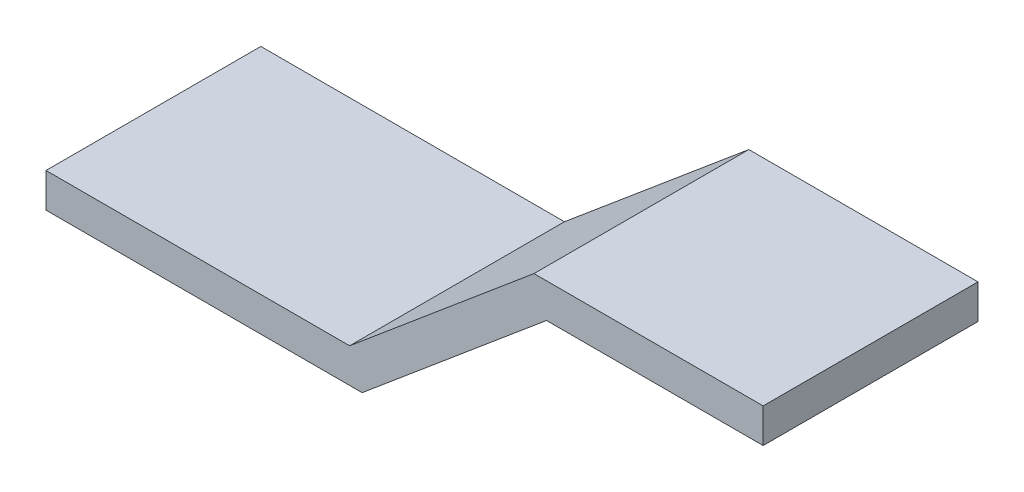
ISO-10303-21;
HEADER;
FILE_DESCRIPTION(('STEP AP214'),'2;1');
FILE_NAME('part.step','',(''),(''),'','','');
FILE_SCHEMA(('AUTOMOTIVE_DESIGN { 1 0 10303 214 1 1 1 1 }'));
ENDSEC;
DATA;
#1=APPLICATION_CONTEXT('core data for automotive mechanical design processes');
#2=APPLICATION_PROTOCOL_DEFINITION('international standard','automotive_design',2000,#1);
#3=PRODUCT_CONTEXT('',#1,'mechanical');
#4=PRODUCT('Part','Part','',(#3));
#5=PRODUCT_RELATED_PRODUCT_CATEGORY('part','',(#4));
#6=PRODUCT_DEFINITION_FORMATION('','',#4);
#7=PRODUCT_DEFINITION_CONTEXT('part definition',#1,'design');
#8=PRODUCT_DEFINITION('design','',#6,#7);
#9=PRODUCT_DEFINITION_SHAPE('','',#8);
#10=(LENGTH_UNIT() NAMED_UNIT(*) SI_UNIT(.MILLI.,.METRE.));
#11=(NAMED_UNIT(*) PLANE_ANGLE_UNIT() SI_UNIT($,.RADIAN.));
#12=(NAMED_UNIT(*) SI_UNIT($,.STERADIAN.) SOLID_ANGLE_UNIT());
#13=UNCERTAINTY_MEASURE_WITH_UNIT(LENGTH_MEASURE(1.E-05),#10,'distance_accuracy_value','');
#14=(GEOMETRIC_REPRESENTATION_CONTEXT(3) GLOBAL_UNCERTAINTY_ASSIGNED_CONTEXT((#13)) GLOBAL_UNIT_ASSIGNED_CONTEXT((#10,
#11,#12)) REPRESENTATION_CONTEXT('',''));
#15=CARTESIAN_POINT('',(0.,0.,0.));
#16=DIRECTION('',(0.,0.,1.));
#17=DIRECTION('',(1.,0.,0.));
#18=AXIS2_PLACEMENT_3D('',#15,#16,#17);
#19=CARTESIAN_POINT('',(186.55301294401,54.,37.5));
#20=DIRECTION('',(-1.,0.,0.));
#21=DIRECTION('',(0.,0.,1.));
#22=AXIS2_PLACEMENT_3D('',#19,#20,#21);
#23=PLANE('',#22);
#24=DIRECTION('',(0.,1.,0.));
#25=VECTOR('',#24,1.);
#26=CARTESIAN_POINT('',(186.55301294401,54.,-37.5));
#27=LINE('',#26,#25);
#28=CARTESIAN_POINT('',(186.55301294401,42.,-37.5));
#29=VERTEX_POINT('',#28);
#30=CARTESIAN_POINT('',(186.55301294401,54.,-37.5));
#31=VERTEX_POINT('',#30);
#32=EDGE_CURVE('E133',#29,#31,#27,.T.);
#33=ORIENTED_EDGE('',*,*,#32,.T.);
#34=DIRECTION('',(0.,0.,-1.));
#35=VECTOR('',#34,1.);
#36=CARTESIAN_POINT('',(186.55301294401,54.,37.5));
#37=LINE('',#36,#35);
#38=CARTESIAN_POINT('',(186.55301294401,54.,37.5));
#39=VERTEX_POINT('',#38);
#40=EDGE_CURVE('E11',#39,#31,#37,.T.);
#41=ORIENTED_EDGE('',*,*,#40,.F.);
#42=DIRECTION('',(0.,1.,0.));
#43=VECTOR('',#42,1.);
#44=CARTESIAN_POINT('',(186.55301294401,54.,37.5));
#45=LINE('',#44,#43);
#46=CARTESIAN_POINT('',(186.55301294401,42.,37.5));
#47=VERTEX_POINT('',#46);
#48=EDGE_CURVE('E147',#47,#39,#45,.T.);
#49=ORIENTED_EDGE('',*,*,#48,.F.);
#50=DIRECTION('',(0.,0.,-1.));
#51=VECTOR('',#50,1.);
#52=CARTESIAN_POINT('',(186.55301294401,42.,37.5));
#53=LINE('',#52,#51);
#54=EDGE_CURVE('E129',#47,#29,#53,.T.);
#55=ORIENTED_EDGE('',*,*,#54,.T.);
#56=EDGE_LOOP('',(#33,#41,#49,#55));
#57=FACE_BOUND('',#56,.T.);
#58=ADVANCED_FACE('F37',(#57),#23,.F.);
#59=CARTESIAN_POINT('',(186.55301294401,54.,37.5));
#60=DIRECTION('',(0.,-1.,0.));
#61=DIRECTION('',(1.,0.,0.));
#62=AXIS2_PLACEMENT_3D('',#59,#60,#61);
#63=PLANE('',#62);
#64=DIRECTION('',(-1.,0.,0.));
#65=VECTOR('',#64,1.);
#66=CARTESIAN_POINT('',(186.55301294401,54.,-37.5));
#67=LINE('',#66,#65);
#68=CARTESIAN_POINT('',(106.55301294401,54.,-37.5));
#69=VERTEX_POINT('',#68);
#70=EDGE_CURVE('E136',#31,#69,#67,.T.);
#71=ORIENTED_EDGE('',*,*,#70,.T.);
#72=DIRECTION('',(0.,0.,-1.));
#73=VECTOR('',#72,1.);
#74=CARTESIAN_POINT('',(106.55301294401,54.,37.5));
#75=LINE('',#74,#73);
#76=CARTESIAN_POINT('',(106.55301294401,54.,37.5));
#77=VERTEX_POINT('',#76);
#78=EDGE_CURVE('E45',#77,#69,#75,.T.);
#79=ORIENTED_EDGE('',*,*,#78,.F.);
#80=DIRECTION('',(-1.,0.,0.));
#81=VECTOR('',#80,1.);
#82=CARTESIAN_POINT('',(186.55301294401,54.,37.5));
#83=LINE('',#82,#81);
#84=EDGE_CURVE('E96',#39,#77,#83,.T.);
#85=ORIENTED_EDGE('',*,*,#84,.F.);
#86=ORIENTED_EDGE('',*,*,#40,.T.);
#87=EDGE_LOOP('',(#71,#79,#85,#86));
#88=FACE_BOUND('',#87,.T.);
#89=ADVANCED_FACE('F182',(#88),#63,.F.);
#90=CARTESIAN_POINT('',(106.55301294401,54.,37.5));
#91=DIRECTION('',(0.642787609686535,-0.766044443118982,0.));
#92=DIRECTION('',(0.766044443118982,0.642787609686535,0.));
#93=AXIS2_PLACEMENT_3D('',#90,#91,#92);
#94=PLANE('',#93);
#95=DIRECTION('',(-0.766044443118982,-0.642787609686535,0.));
#96=VECTOR('',#95,1.);
#97=CARTESIAN_POINT('',(106.55301294401,54.,-37.5));
#98=LINE('',#97,#96);
#99=CARTESIAN_POINT('',(42.1983189439217,0.,-37.5));
#100=VERTEX_POINT('',#99);
#101=EDGE_CURVE('E138',#69,#100,#98,.T.);
#102=ORIENTED_EDGE('',*,*,#101,.T.);
#103=DIRECTION('',(0.,0.,-1.));
#104=VECTOR('',#103,1.);
#105=CARTESIAN_POINT('',(42.1983189439217,0.,37.5));
#106=LINE('',#105,#104);
#107=CARTESIAN_POINT('',(42.1983189439217,0.,37.5));
#108=VERTEX_POINT('',#107);
#109=EDGE_CURVE('E154',#108,#100,#106,.T.);
#110=ORIENTED_EDGE('',*,*,#109,.F.);
#111=DIRECTION('',(-0.766044443118982,-0.642787609686535,0.));
#112=VECTOR('',#111,1.);
#113=CARTESIAN_POINT('',(106.55301294401,54.,37.5));
#114=LINE('',#113,#112);
#115=EDGE_CURVE('E162',#77,#108,#114,.T.);
#116=ORIENTED_EDGE('',*,*,#115,.F.);
#117=ORIENTED_EDGE('',*,*,#78,.T.);
#118=EDGE_LOOP('',(#102,#110,#116,#117));
#119=FACE_BOUND('',#118,.T.);
#120=ADVANCED_FACE('F160',(#119),#94,.F.);
#121=CARTESIAN_POINT('',(42.1983189439217,0.,37.5));
#122=DIRECTION('',(0.,-1.,0.));
#123=DIRECTION('',(1.,0.,0.));
#124=AXIS2_PLACEMENT_3D('',#121,#122,#123);
#125=PLANE('',#124);
#126=DIRECTION('',(-1.,0.,0.));
#127=VECTOR('',#126,1.);
#128=CARTESIAN_POINT('',(42.1983189439217,0.,-37.5));
#129=LINE('',#128,#127);
#130=CARTESIAN_POINT('',(-63.8016810560783,0.,-37.5));
#131=VERTEX_POINT('',#130);
#132=EDGE_CURVE('E140',#100,#131,#129,.T.);
#133=ORIENTED_EDGE('',*,*,#132,.T.);
#134=DIRECTION('',(0.,0.,-1.));
#135=VECTOR('',#134,1.);
#136=CARTESIAN_POINT('',(-63.8016810560783,0.,37.5));
#137=LINE('',#136,#135);
#138=CARTESIAN_POINT('',(-63.8016810560783,0.,37.5));
#139=VERTEX_POINT('',#138);
#140=EDGE_CURVE('E151',#139,#131,#137,.T.);
#141=ORIENTED_EDGE('',*,*,#140,.F.);
#142=DIRECTION('',(-1.,0.,0.));
#143=VECTOR('',#142,1.);
#144=CARTESIAN_POINT('',(42.1983189439217,0.,37.5));
#145=LINE('',#144,#143);
#146=EDGE_CURVE('E174',#108,#139,#145,.T.);
#147=ORIENTED_EDGE('',*,*,#146,.F.);
#148=ORIENTED_EDGE('',*,*,#109,.T.);
#149=EDGE_LOOP('',(#133,#141,#147,#148));
#150=FACE_BOUND('',#149,.T.);
#151=ADVANCED_FACE('F170',(#150),#125,.F.);
#152=CARTESIAN_POINT('',(-63.8016810560783,0.,37.5));
#153=DIRECTION('',(1.,0.,0.));
#154=DIRECTION('',(0.,0.,-1.));
#155=AXIS2_PLACEMENT_3D('',#152,#153,#154);
#156=PLANE('',#155);
#157=DIRECTION('',(0.,-1.,0.));
#158=VECTOR('',#157,1.);
#159=CARTESIAN_POINT('',(-63.8016810560783,0.,-37.5));
#160=LINE('',#159,#158);
#161=CARTESIAN_POINT('',(-63.8016810560783,-12.,-37.5));
#162=VERTEX_POINT('',#161);
#163=EDGE_CURVE('E142',#131,#162,#160,.T.);
#164=ORIENTED_EDGE('',*,*,#163,.T.);
#165=DIRECTION('',(0.,0.,-1.));
#166=VECTOR('',#165,1.);
#167=CARTESIAN_POINT('',(-63.8016810560783,-12.,37.5));
#168=LINE('',#167,#166);
#169=CARTESIAN_POINT('',(-63.8016810560783,-12.,37.5));
#170=VERTEX_POINT('',#169);
#171=EDGE_CURVE('E124',#170,#162,#168,.T.);
#172=ORIENTED_EDGE('',*,*,#171,.F.);
#173=DIRECTION('',(0.,-1.,0.));
#174=VECTOR('',#173,1.);
#175=CARTESIAN_POINT('',(-63.8016810560783,0.,37.5));
#176=LINE('',#175,#174);
#177=EDGE_CURVE('E115',#139,#170,#176,.T.);
#178=ORIENTED_EDGE('',*,*,#177,.F.);
#179=ORIENTED_EDGE('',*,*,#140,.T.);
#180=EDGE_LOOP('',(#164,#172,#178,#179));
#181=FACE_BOUND('',#180,.T.);
#182=ADVANCED_FACE('F173',(#181),#156,.F.);
#183=CARTESIAN_POINT('',(46.5659617551161,-12.,37.5));
#184=DIRECTION('',(0.,1.,0.));
#185=DIRECTION('',(0.,0.,1.));
#186=AXIS2_PLACEMENT_3D('',#183,#184,#185);
#187=PLANE('',#186);
#188=DIRECTION('',(1.,0.,0.));
#189=VECTOR('',#188,1.);
#190=CARTESIAN_POINT('',(46.5659617551161,-12.,-37.5));
#191=LINE('',#190,#189);
#192=CARTESIAN_POINT('',(46.5659617551161,-12.,-37.5));
#193=VERTEX_POINT('',#192);
#194=EDGE_CURVE('E123',#162,#193,#191,.T.);
#195=ORIENTED_EDGE('',*,*,#194,.T.);
#196=DIRECTION('',(0.,0.,-1.));
#197=VECTOR('',#196,1.);
#198=CARTESIAN_POINT('',(46.5659617551161,-12.,37.5));
#199=LINE('',#198,#197);
#200=CARTESIAN_POINT('',(46.5659617551161,-12.,37.5));
#201=VERTEX_POINT('',#200);
#202=EDGE_CURVE('E120',#201,#193,#199,.T.);
#203=ORIENTED_EDGE('',*,*,#202,.F.);
#204=DIRECTION('',(1.,0.,0.));
#205=VECTOR('',#204,1.);
#206=CARTESIAN_POINT('',(46.5659617551161,-12.,37.5));
#207=LINE('',#206,#205);
#208=EDGE_CURVE('E109',#170,#201,#207,.T.);
#209=ORIENTED_EDGE('',*,*,#208,.F.);
#210=ORIENTED_EDGE('',*,*,#171,.T.);
#211=EDGE_LOOP('',(#195,#203,#209,#210));
#212=FACE_BOUND('',#211,.T.);
#213=ADVANCED_FACE('F121',(#212),#187,.F.);
#214=CARTESIAN_POINT('',(110.920655755204,42.,37.5));
#215=DIRECTION('',(-0.642787609686535,0.766044443118982,0.));
#216=DIRECTION('',(-0.766044443118982,-0.642787609686535,0.));
#217=AXIS2_PLACEMENT_3D('',#214,#215,#216);
#218=PLANE('',#217);
#219=DIRECTION('',(0.766044443118982,0.642787609686535,0.));
#220=VECTOR('',#219,1.);
#221=CARTESIAN_POINT('',(110.920655755204,42.,-37.5));
#222=LINE('',#221,#220);
#223=CARTESIAN_POINT('',(110.920655755204,42.,-37.5));
#224=VERTEX_POINT('',#223);
#225=EDGE_CURVE('E82',#193,#224,#222,.T.);
#226=ORIENTED_EDGE('',*,*,#225,.T.);
#227=DIRECTION('',(0.,0.,-1.));
#228=VECTOR('',#227,1.);
#229=CARTESIAN_POINT('',(110.920655755204,42.,37.5));
#230=LINE('',#229,#228);
#231=CARTESIAN_POINT('',(110.920655755204,42.,37.5));
#232=VERTEX_POINT('',#231);
#233=EDGE_CURVE('E125',#232,#224,#230,.T.);
#234=ORIENTED_EDGE('',*,*,#233,.F.);
#235=DIRECTION('',(0.766044443118982,0.642787609686535,0.));
#236=VECTOR('',#235,1.);
#237=CARTESIAN_POINT('',(110.920655755204,42.,37.5));
#238=LINE('',#237,#236);
#239=EDGE_CURVE('E113',#201,#232,#238,.T.);
#240=ORIENTED_EDGE('',*,*,#239,.F.);
#241=ORIENTED_EDGE('',*,*,#202,.T.);
#242=EDGE_LOOP('',(#226,#234,#240,#241));
#243=FACE_BOUND('',#242,.T.);
#244=ADVANCED_FACE('F127',(#243),#218,.F.);
#245=CARTESIAN_POINT('',(186.55301294401,42.,37.5));
#246=DIRECTION('',(0.,1.,0.));
#247=DIRECTION('',(0.,0.,1.));
#248=AXIS2_PLACEMENT_3D('',#245,#246,#247);
#249=PLANE('',#248);
#250=DIRECTION('',(1.,0.,0.));
#251=VECTOR('',#250,1.);
#252=CARTESIAN_POINT('',(186.55301294401,42.,-37.5));
#253=LINE('',#252,#251);
#254=EDGE_CURVE('E88',#224,#29,#253,.T.);
#255=ORIENTED_EDGE('',*,*,#254,.T.);
#256=ORIENTED_EDGE('',*,*,#54,.F.);
#257=DIRECTION('',(1.,0.,0.));
#258=VECTOR('',#257,1.);
#259=CARTESIAN_POINT('',(186.55301294401,42.,37.5));
#260=LINE('',#259,#258);
#261=EDGE_CURVE('E53',#232,#47,#260,.T.);
#262=ORIENTED_EDGE('',*,*,#261,.F.);
#263=ORIENTED_EDGE('',*,*,#233,.T.);
#264=EDGE_LOOP('',(#255,#256,#262,#263));
#265=FACE_BOUND('',#264,.T.);
#266=ADVANCED_FACE('F198',(#265),#249,.F.);
#267=CARTESIAN_POINT('',(0.,0.,37.5));
#268=DIRECTION('',(0.,0.,-1.));
#269=DIRECTION('',(-1.,0.,0.));
#270=AXIS2_PLACEMENT_3D('',#267,#268,#269);
#271=PLANE('',#270);
#272=ORIENTED_EDGE('',*,*,#48,.T.);
#273=ORIENTED_EDGE('',*,*,#84,.T.);
#274=ORIENTED_EDGE('',*,*,#115,.T.);
#275=ORIENTED_EDGE('',*,*,#146,.T.);
#276=ORIENTED_EDGE('',*,*,#177,.T.);
#277=ORIENTED_EDGE('',*,*,#208,.T.);
#278=ORIENTED_EDGE('',*,*,#239,.T.);
#279=ORIENTED_EDGE('',*,*,#261,.T.);
#280=EDGE_LOOP('',(#272,#273,#274,#275,#276,#277,#278,#279));
#281=FACE_BOUND('',#280,.T.);
#282=ADVANCED_FACE('F111',(#281),#271,.F.);
#283=CARTESIAN_POINT('',(0.,0.,-37.5));
#284=DIRECTION('',(0.,0.,-1.));
#285=DIRECTION('',(-1.,0.,0.));
#286=AXIS2_PLACEMENT_3D('',#283,#284,#285);
#287=PLANE('',#286);
#288=ORIENTED_EDGE('',*,*,#32,.F.);
#289=ORIENTED_EDGE('',*,*,#254,.F.);
#290=ORIENTED_EDGE('',*,*,#225,.F.);
#291=ORIENTED_EDGE('',*,*,#194,.F.);
#292=ORIENTED_EDGE('',*,*,#163,.F.);
#293=ORIENTED_EDGE('',*,*,#132,.F.);
#294=ORIENTED_EDGE('',*,*,#101,.F.);
#295=ORIENTED_EDGE('',*,*,#70,.F.);
#296=EDGE_LOOP('',(#288,#289,#290,#291,#292,#293,#294,#295));
#297=FACE_BOUND('',#296,.T.);
#298=ADVANCED_FACE('F166',(#297),#287,.T.);
#299=CLOSED_SHELL('',(#58,#89,#120,#151,#182,#213,#244,#266,#282,#298));
#300=MANIFOLD_SOLID_BREP('B2',#299);
#301=ADVANCED_BREP_SHAPE_REPRESENTATION('',(#18,#300),#14);
#302=SHAPE_DEFINITION_REPRESENTATION(#9,#301);
ENDSEC;
END-ISO-10303-21;
